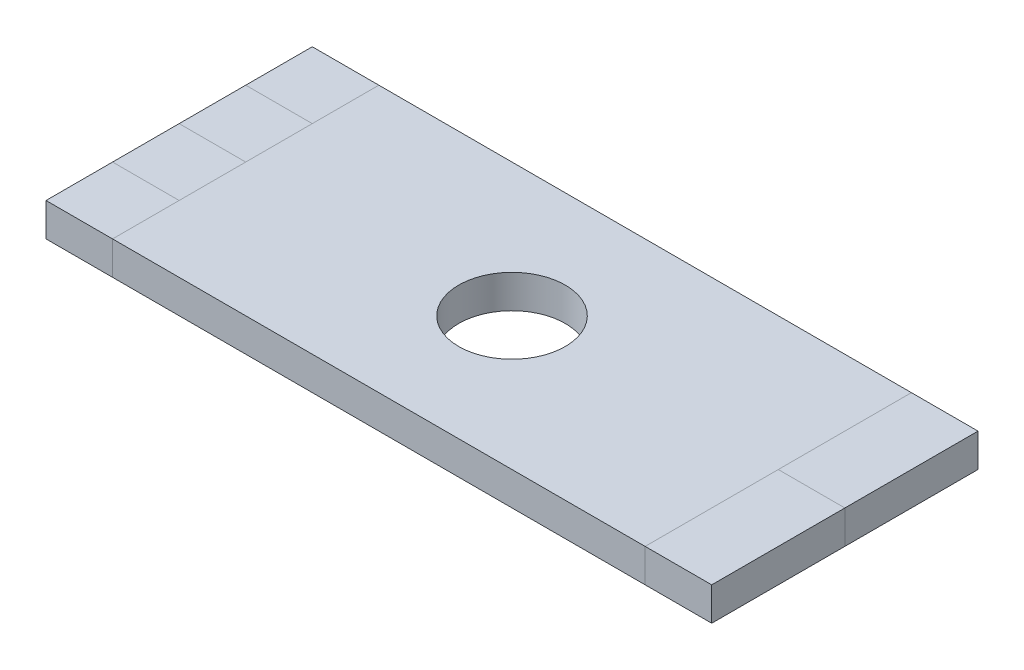
ISO-10303-21;
HEADER;
FILE_DESCRIPTION(('STEP AP214'),'2;1');
FILE_NAME('part.step','',(''),(''),'','','');
FILE_SCHEMA(('AUTOMOTIVE_DESIGN { 1 0 10303 214 1 1 1 1 }'));
ENDSEC;
DATA;
#1=APPLICATION_CONTEXT('core data for automotive mechanical design processes');
#2=APPLICATION_PROTOCOL_DEFINITION('international standard','automotive_design',2000,#1);
#3=PRODUCT_CONTEXT('',#1,'mechanical');
#4=PRODUCT('Part','Part','',(#3));
#5=PRODUCT_RELATED_PRODUCT_CATEGORY('part','',(#4));
#6=PRODUCT_DEFINITION_FORMATION('','',#4);
#7=PRODUCT_DEFINITION_CONTEXT('part definition',#1,'design');
#8=PRODUCT_DEFINITION('design','',#6,#7);
#9=PRODUCT_DEFINITION_SHAPE('','',#8);
#10=(LENGTH_UNIT() NAMED_UNIT(*) SI_UNIT(.MILLI.,.METRE.));
#11=(NAMED_UNIT(*) PLANE_ANGLE_UNIT() SI_UNIT($,.RADIAN.));
#12=(NAMED_UNIT(*) SI_UNIT($,.STERADIAN.) SOLID_ANGLE_UNIT());
#13=UNCERTAINTY_MEASURE_WITH_UNIT(LENGTH_MEASURE(1.E-05),#10,'distance_accuracy_value','');
#14=(GEOMETRIC_REPRESENTATION_CONTEXT(3) GLOBAL_UNCERTAINTY_ASSIGNED_CONTEXT((#13)) GLOBAL_UNIT_ASSIGNED_CONTEXT((#10,
#11,#12)) REPRESENTATION_CONTEXT('',''));
#15=CARTESIAN_POINT('',(0.,0.,0.));
#16=DIRECTION('',(0.,0.,1.));
#17=DIRECTION('',(1.,0.,0.));
#18=AXIS2_PLACEMENT_3D('',#15,#16,#17);
#19=CARTESIAN_POINT('',(31.75,0.,0.));
#20=DIRECTION('',(0.,0.,1.));
#21=DIRECTION('',(1.,0.,0.));
#22=AXIS2_PLACEMENT_3D('',#19,#20,#21);
#23=PLANE('',#22);
#24=DIRECTION('',(0.,1.,0.));
#25=VECTOR('',#24,1.);
#26=CARTESIAN_POINT('',(25.4,0.,0.));
#27=LINE('',#26,#25);
#28=CARTESIAN_POINT('',(25.4,0.,0.));
#29=VERTEX_POINT('',#28);
#30=CARTESIAN_POINT('',(25.4,3.175,0.));
#31=VERTEX_POINT('',#30);
#32=EDGE_CURVE('E121',#29,#31,#27,.T.);
#33=ORIENTED_EDGE('',*,*,#32,.F.);
#34=DIRECTION('',(-1.,0.,0.));
#35=VECTOR('',#34,1.);
#36=CARTESIAN_POINT('',(31.75,0.,0.));
#37=LINE('',#36,#35);
#38=CARTESIAN_POINT('',(31.75,0.,0.));
#39=VERTEX_POINT('',#38);
#40=EDGE_CURVE('E13',#39,#29,#37,.T.);
#41=ORIENTED_EDGE('',*,*,#40,.F.);
#42=DIRECTION('',(0.,1.,0.));
#43=VECTOR('',#42,1.);
#44=CARTESIAN_POINT('',(31.75,0.,0.));
#45=LINE('',#44,#43);
#46=CARTESIAN_POINT('',(31.75,3.175,0.));
#47=VERTEX_POINT('',#46);
#48=EDGE_CURVE('E109',#39,#47,#45,.T.);
#49=ORIENTED_EDGE('',*,*,#48,.T.);
#50=DIRECTION('',(-1.,0.,0.));
#51=VECTOR('',#50,1.);
#52=CARTESIAN_POINT('',(31.75,3.175,0.));
#53=LINE('',#52,#51);
#54=EDGE_CURVE('E98',#47,#31,#53,.T.);
#55=ORIENTED_EDGE('',*,*,#54,.T.);
#56=EDGE_LOOP('',(#33,#41,#49,#55));
#57=FACE_BOUND('',#56,.T.);
#58=ADVANCED_FACE('F59',(#57),#23,.T.);
#59=CARTESIAN_POINT('',(31.75,0.,0.));
#60=DIRECTION('',(0.,1.,0.));
#61=DIRECTION('',(0.,0.,1.));
#62=AXIS2_PLACEMENT_3D('',#59,#60,#61);
#63=PLANE('',#62);
#64=DIRECTION('',(0.,0.,-1.));
#65=VECTOR('',#64,1.);
#66=CARTESIAN_POINT('',(25.4,0.,0.));
#67=LINE('',#66,#65);
#68=CARTESIAN_POINT('',(25.4,0.,-12.7));
#69=VERTEX_POINT('',#68);
#70=EDGE_CURVE('E114',#29,#69,#67,.T.);
#71=ORIENTED_EDGE('',*,*,#70,.T.);
#72=DIRECTION('',(-1.,0.,0.));
#73=VECTOR('',#72,1.);
#74=CARTESIAN_POINT('',(31.75,0.,-12.7));
#75=LINE('',#74,#73);
#76=CARTESIAN_POINT('',(31.75,0.,-12.7));
#77=VERTEX_POINT('',#76);
#78=EDGE_CURVE('E67',#77,#69,#75,.T.);
#79=ORIENTED_EDGE('',*,*,#78,.F.);
#80=DIRECTION('',(0.,0.,-1.));
#81=VECTOR('',#80,1.);
#82=CARTESIAN_POINT('',(31.75,0.,0.));
#83=LINE('',#82,#81);
#84=EDGE_CURVE('E104',#39,#77,#83,.T.);
#85=ORIENTED_EDGE('',*,*,#84,.F.);
#86=ORIENTED_EDGE('',*,*,#40,.T.);
#87=EDGE_LOOP('',(#71,#79,#85,#86));
#88=FACE_BOUND('',#87,.T.);
#89=ADVANCED_FACE('F112',(#88),#63,.F.);
#90=CARTESIAN_POINT('',(31.75,0.,-12.7));
#91=DIRECTION('',(0.,0.,1.));
#92=DIRECTION('',(1.,0.,0.));
#93=AXIS2_PLACEMENT_3D('',#90,#91,#92);
#94=PLANE('',#93);
#95=DIRECTION('',(0.,1.,0.));
#96=VECTOR('',#95,1.);
#97=CARTESIAN_POINT('',(25.4,0.,-12.7));
#98=LINE('',#97,#96);
#99=CARTESIAN_POINT('',(25.4,3.175,-12.7));
#100=VERTEX_POINT('',#99);
#101=EDGE_CURVE('E91',#69,#100,#98,.T.);
#102=ORIENTED_EDGE('',*,*,#101,.T.);
#103=DIRECTION('',(-1.,0.,0.));
#104=VECTOR('',#103,1.);
#105=CARTESIAN_POINT('',(31.75,3.175,-12.7));
#106=LINE('',#105,#104);
#107=CARTESIAN_POINT('',(31.75,3.175,-12.7));
#108=VERTEX_POINT('',#107);
#109=EDGE_CURVE('E115',#108,#100,#106,.T.);
#110=ORIENTED_EDGE('',*,*,#109,.F.);
#111=DIRECTION('',(0.,1.,0.));
#112=VECTOR('',#111,1.);
#113=CARTESIAN_POINT('',(31.75,0.,-12.7));
#114=LINE('',#113,#112);
#115=EDGE_CURVE('E108',#77,#108,#114,.T.);
#116=ORIENTED_EDGE('',*,*,#115,.F.);
#117=ORIENTED_EDGE('',*,*,#78,.T.);
#118=EDGE_LOOP('',(#102,#110,#116,#117));
#119=FACE_BOUND('',#118,.T.);
#120=ADVANCED_FACE('F116',(#119),#94,.F.);
#121=CARTESIAN_POINT('',(31.75,3.175,0.));
#122=DIRECTION('',(0.,-1.,0.));
#123=DIRECTION('',(0.,0.,-1.));
#124=AXIS2_PLACEMENT_3D('',#121,#122,#123);
#125=PLANE('',#124);
#126=DIRECTION('',(0.,0.,1.));
#127=VECTOR('',#126,1.);
#128=CARTESIAN_POINT('',(25.4,3.175,0.));
#129=LINE('',#128,#127);
#130=EDGE_CURVE('E126',#100,#31,#129,.T.);
#131=ORIENTED_EDGE('',*,*,#130,.T.);
#132=ORIENTED_EDGE('',*,*,#54,.F.);
#133=DIRECTION('',(0.,0.,1.));
#134=VECTOR('',#133,1.);
#135=CARTESIAN_POINT('',(31.75,3.175,0.));
#136=LINE('',#135,#134);
#137=EDGE_CURVE('E75',#108,#47,#136,.T.);
#138=ORIENTED_EDGE('',*,*,#137,.F.);
#139=ORIENTED_EDGE('',*,*,#109,.T.);
#140=EDGE_LOOP('',(#131,#132,#138,#139));
#141=FACE_BOUND('',#140,.T.);
#142=ADVANCED_FACE('F132',(#141),#125,.F.);
#143=CARTESIAN_POINT('',(31.75,0.,0.));
#144=DIRECTION('',(1.,0.,0.));
#145=DIRECTION('',(0.,0.,-1.));
#146=AXIS2_PLACEMENT_3D('',#143,#144,#145);
#147=PLANE('',#146);
#148=ORIENTED_EDGE('',*,*,#48,.F.);
#149=ORIENTED_EDGE('',*,*,#84,.T.);
#150=ORIENTED_EDGE('',*,*,#115,.T.);
#151=ORIENTED_EDGE('',*,*,#137,.T.);
#152=EDGE_LOOP('',(#148,#149,#150,#151));
#153=FACE_BOUND('',#152,.T.);
#154=ADVANCED_FACE('F106',(#153),#147,.T.);
#155=CARTESIAN_POINT('',(25.4,0.,0.));
#156=DIRECTION('',(1.,0.,0.));
#157=DIRECTION('',(0.,0.,-1.));
#158=AXIS2_PLACEMENT_3D('',#155,#156,#157);
#159=PLANE('',#158);
#160=ORIENTED_EDGE('',*,*,#32,.T.);
#161=ORIENTED_EDGE('',*,*,#130,.F.);
#162=ORIENTED_EDGE('',*,*,#101,.F.);
#163=ORIENTED_EDGE('',*,*,#70,.F.);
#164=EDGE_LOOP('',(#160,#161,#162,#163));
#165=FACE_BOUND('',#164,.T.);
#166=ADVANCED_FACE('F134',(#165),#159,.F.);
#167=CLOSED_SHELL('',(#58,#89,#120,#142,#154,#166));
#168=MANIFOLD_SOLID_BREP('B2',#167);
#169=CARTESIAN_POINT('',(31.75,0.,0.));
#170=DIRECTION('',(0.,1.,0.));
#171=DIRECTION('',(0.,0.,1.));
#172=AXIS2_PLACEMENT_3D('',#169,#170,#171);
#173=PLANE('',#172);
#174=DIRECTION('',(0.,0.,-1.));
#175=VECTOR('',#174,1.);
#176=CARTESIAN_POINT('',(25.4,0.,0.));
#177=LINE('',#176,#175);
#178=CARTESIAN_POINT('',(25.4,0.,12.7));
#179=VERTEX_POINT('',#178);
#180=CARTESIAN_POINT('',(25.4,0.,0.));
#181=VERTEX_POINT('',#180);
#182=EDGE_CURVE('E271',#179,#181,#177,.T.);
#183=ORIENTED_EDGE('',*,*,#182,.T.);
#184=DIRECTION('',(-1.,0.,0.));
#185=VECTOR('',#184,1.);
#186=CARTESIAN_POINT('',(31.75,0.,0.));
#187=LINE('',#186,#185);
#188=CARTESIAN_POINT('',(31.75,0.,0.));
#189=VERTEX_POINT('',#188);
#190=EDGE_CURVE('E57',#189,#181,#187,.T.);
#191=ORIENTED_EDGE('',*,*,#190,.F.);
#192=DIRECTION('',(0.,0.,-1.));
#193=VECTOR('',#192,1.);
#194=CARTESIAN_POINT('',(31.75,0.,0.));
#195=LINE('',#194,#193);
#196=CARTESIAN_POINT('',(31.75,0.,12.7));
#197=VERTEX_POINT('',#196);
#198=EDGE_CURVE('E258',#197,#189,#195,.T.);
#199=ORIENTED_EDGE('',*,*,#198,.F.);
#200=DIRECTION('',(-1.,0.,0.));
#201=VECTOR('',#200,1.);
#202=CARTESIAN_POINT('',(31.75,0.,12.7));
#203=LINE('',#202,#201);
#204=EDGE_CURVE('E267',#197,#179,#203,.T.);
#205=ORIENTED_EDGE('',*,*,#204,.T.);
#206=EDGE_LOOP('',(#183,#191,#199,#205));
#207=FACE_BOUND('',#206,.T.);
#208=ADVANCED_FACE('F208',(#207),#173,.F.);
#209=CARTESIAN_POINT('',(31.75,0.,0.));
#210=DIRECTION('',(0.,0.,1.));
#211=DIRECTION('',(1.,0.,0.));
#212=AXIS2_PLACEMENT_3D('',#209,#210,#211);
#213=PLANE('',#212);
#214=DIRECTION('',(0.,1.,0.));
#215=VECTOR('',#214,1.);
#216=CARTESIAN_POINT('',(25.4,0.,0.));
#217=LINE('',#216,#215);
#218=CARTESIAN_POINT('',(25.4,3.175,0.));
#219=VERTEX_POINT('',#218);
#220=EDGE_CURVE('E262',#181,#219,#217,.T.);
#221=ORIENTED_EDGE('',*,*,#220,.T.);
#222=DIRECTION('',(-1.,0.,0.));
#223=VECTOR('',#222,1.);
#224=CARTESIAN_POINT('',(31.75,3.175,0.));
#225=LINE('',#224,#223);
#226=CARTESIAN_POINT('',(31.75,3.175,0.));
#227=VERTEX_POINT('',#226);
#228=EDGE_CURVE('E215',#227,#219,#225,.T.);
#229=ORIENTED_EDGE('',*,*,#228,.F.);
#230=DIRECTION('',(0.,1.,0.));
#231=VECTOR('',#230,1.);
#232=CARTESIAN_POINT('',(31.75,0.,0.));
#233=LINE('',#232,#231);
#234=EDGE_CURVE('E253',#189,#227,#233,.T.);
#235=ORIENTED_EDGE('',*,*,#234,.F.);
#236=ORIENTED_EDGE('',*,*,#190,.T.);
#237=EDGE_LOOP('',(#221,#229,#235,#236));
#238=FACE_BOUND('',#237,.T.);
#239=ADVANCED_FACE('F261',(#238),#213,.F.);
#240=CARTESIAN_POINT('',(31.75,3.175,0.));
#241=DIRECTION('',(0.,-1.,0.));
#242=DIRECTION('',(0.,0.,-1.));
#243=AXIS2_PLACEMENT_3D('',#240,#241,#242);
#244=PLANE('',#243);
#245=DIRECTION('',(0.,0.,1.));
#246=VECTOR('',#245,1.);
#247=CARTESIAN_POINT('',(25.4,3.175,0.));
#248=LINE('',#247,#246);
#249=CARTESIAN_POINT('',(25.4,3.175,12.7));
#250=VERTEX_POINT('',#249);
#251=EDGE_CURVE('E240',#219,#250,#248,.T.);
#252=ORIENTED_EDGE('',*,*,#251,.T.);
#253=DIRECTION('',(-1.,0.,0.));
#254=VECTOR('',#253,1.);
#255=CARTESIAN_POINT('',(31.75,3.175,12.7));
#256=LINE('',#255,#254);
#257=CARTESIAN_POINT('',(31.75,3.175,12.7));
#258=VERTEX_POINT('',#257);
#259=EDGE_CURVE('E264',#258,#250,#256,.T.);
#260=ORIENTED_EDGE('',*,*,#259,.F.);
#261=DIRECTION('',(0.,0.,1.));
#262=VECTOR('',#261,1.);
#263=CARTESIAN_POINT('',(31.75,3.175,0.));
#264=LINE('',#263,#262);
#265=EDGE_CURVE('E256',#227,#258,#264,.T.);
#266=ORIENTED_EDGE('',*,*,#265,.F.);
#267=ORIENTED_EDGE('',*,*,#228,.T.);
#268=EDGE_LOOP('',(#252,#260,#266,#267));
#269=FACE_BOUND('',#268,.T.);
#270=ADVANCED_FACE('F265',(#269),#244,.F.);
#271=CARTESIAN_POINT('',(31.75,0.,12.7));
#272=DIRECTION('',(0.,0.,-1.));
#273=DIRECTION('',(-1.,0.,0.));
#274=AXIS2_PLACEMENT_3D('',#271,#272,#273);
#275=PLANE('',#274);
#276=DIRECTION('',(0.,-1.,0.));
#277=VECTOR('',#276,1.);
#278=CARTESIAN_POINT('',(25.4,0.,12.7));
#279=LINE('',#278,#277);
#280=EDGE_CURVE('E246',#250,#179,#279,.T.);
#281=ORIENTED_EDGE('',*,*,#280,.T.);
#282=ORIENTED_EDGE('',*,*,#204,.F.);
#283=DIRECTION('',(0.,-1.,0.));
#284=VECTOR('',#283,1.);
#285=CARTESIAN_POINT('',(31.75,0.,12.7));
#286=LINE('',#285,#284);
#287=EDGE_CURVE('E223',#258,#197,#286,.T.);
#288=ORIENTED_EDGE('',*,*,#287,.F.);
#289=ORIENTED_EDGE('',*,*,#259,.T.);
#290=EDGE_LOOP('',(#281,#282,#288,#289));
#291=FACE_BOUND('',#290,.T.);
#292=ADVANCED_FACE('F279',(#291),#275,.F.);
#293=CARTESIAN_POINT('',(31.75,0.,0.));
#294=DIRECTION('',(1.,0.,0.));
#295=DIRECTION('',(0.,0.,-1.));
#296=AXIS2_PLACEMENT_3D('',#293,#294,#295);
#297=PLANE('',#296);
#298=ORIENTED_EDGE('',*,*,#198,.T.);
#299=ORIENTED_EDGE('',*,*,#234,.T.);
#300=ORIENTED_EDGE('',*,*,#265,.T.);
#301=ORIENTED_EDGE('',*,*,#287,.T.);
#302=EDGE_LOOP('',(#298,#299,#300,#301));
#303=FACE_BOUND('',#302,.T.);
#304=ADVANCED_FACE('F254',(#303),#297,.T.);
#305=CARTESIAN_POINT('',(25.4,0.,0.));
#306=DIRECTION('',(1.,0.,0.));
#307=DIRECTION('',(0.,0.,-1.));
#308=AXIS2_PLACEMENT_3D('',#305,#306,#307);
#309=PLANE('',#308);
#310=ORIENTED_EDGE('',*,*,#182,.F.);
#311=ORIENTED_EDGE('',*,*,#280,.F.);
#312=ORIENTED_EDGE('',*,*,#251,.F.);
#313=ORIENTED_EDGE('',*,*,#220,.F.);
#314=EDGE_LOOP('',(#310,#311,#312,#313));
#315=FACE_BOUND('',#314,.T.);
#316=ADVANCED_FACE('F282',(#315),#309,.F.);
#317=CLOSED_SHELL('',(#208,#239,#270,#292,#304,#316));
#318=MANIFOLD_SOLID_BREP('B7',#317);
#319=CARTESIAN_POINT('',(-31.75,3.175,0.));
#320=DIRECTION('',(0.,-1.,0.));
#321=DIRECTION('',(0.,0.,-1.));
#322=AXIS2_PLACEMENT_3D('',#319,#320,#321);
#323=PLANE('',#322);
#324=DIRECTION('',(0.,0.,-1.));
#325=VECTOR('',#324,1.);
#326=CARTESIAN_POINT('',(-25.4,3.175,0.));
#327=LINE('',#326,#325);
#328=CARTESIAN_POINT('',(-25.4,3.175,12.7));
#329=VERTEX_POINT('',#328);
#330=CARTESIAN_POINT('',(-25.4,3.175,6.35));
#331=VERTEX_POINT('',#330);
#332=EDGE_CURVE('E419',#329,#331,#327,.T.);
#333=ORIENTED_EDGE('',*,*,#332,.T.);
#334=DIRECTION('',(1.,0.,0.));
#335=VECTOR('',#334,1.);
#336=CARTESIAN_POINT('',(-31.75,3.175,6.35));
#337=LINE('',#336,#335);
#338=CARTESIAN_POINT('',(-31.75,3.175,6.35));
#339=VERTEX_POINT('',#338);
#340=EDGE_CURVE('E206',#339,#331,#337,.T.);
#341=ORIENTED_EDGE('',*,*,#340,.F.);
#342=DIRECTION('',(0.,0.,-1.));
#343=VECTOR('',#342,1.);
#344=CARTESIAN_POINT('',(-31.75,3.175,0.));
#345=LINE('',#344,#343);
#346=CARTESIAN_POINT('',(-31.75,3.175,12.7));
#347=VERTEX_POINT('',#346);
#348=EDGE_CURVE('E407',#347,#339,#345,.T.);
#349=ORIENTED_EDGE('',*,*,#348,.F.);
#350=DIRECTION('',(1.,0.,0.));
#351=VECTOR('',#350,1.);
#352=CARTESIAN_POINT('',(-31.75,3.175,12.7));
#353=LINE('',#352,#351);
#354=EDGE_CURVE('E415',#347,#329,#353,.T.);
#355=ORIENTED_EDGE('',*,*,#354,.T.);
#356=EDGE_LOOP('',(#333,#341,#349,#355));
#357=FACE_BOUND('',#356,.T.);
#358=ADVANCED_FACE('F356',(#357),#323,.F.);
#359=CARTESIAN_POINT('',(-31.75,0.,6.35));
#360=DIRECTION('',(0.,0.,1.));
#361=DIRECTION('',(0.,-1.,0.));
#362=AXIS2_PLACEMENT_3D('',#359,#360,#361);
#363=PLANE('',#362);
#364=DIRECTION('',(0.,-1.,0.));
#365=VECTOR('',#364,1.);
#366=CARTESIAN_POINT('',(-25.4,0.,6.35));
#367=LINE('',#366,#365);
#368=CARTESIAN_POINT('',(-25.4,0.,6.35));
#369=VERTEX_POINT('',#368);
#370=EDGE_CURVE('E411',#331,#369,#367,.T.);
#371=ORIENTED_EDGE('',*,*,#370,.T.);
#372=DIRECTION('',(1.,0.,0.));
#373=VECTOR('',#372,1.);
#374=CARTESIAN_POINT('',(-31.75,0.,6.35));
#375=LINE('',#374,#373);
#376=CARTESIAN_POINT('',(-31.75,0.,6.35));
#377=VERTEX_POINT('',#376);
#378=EDGE_CURVE('E364',#377,#369,#375,.T.);
#379=ORIENTED_EDGE('',*,*,#378,.F.);
#380=DIRECTION('',(0.,-1.,0.));
#381=VECTOR('',#380,1.);
#382=CARTESIAN_POINT('',(-31.75,0.,6.35));
#383=LINE('',#382,#381);
#384=EDGE_CURVE('E402',#339,#377,#383,.T.);
#385=ORIENTED_EDGE('',*,*,#384,.F.);
#386=ORIENTED_EDGE('',*,*,#340,.T.);
#387=EDGE_LOOP('',(#371,#379,#385,#386));
#388=FACE_BOUND('',#387,.T.);
#389=ADVANCED_FACE('F410',(#388),#363,.F.);
#390=CARTESIAN_POINT('',(-31.75,0.,0.));
#391=DIRECTION('',(0.,1.,0.));
#392=DIRECTION('',(0.,0.,1.));
#393=AXIS2_PLACEMENT_3D('',#390,#391,#392);
#394=PLANE('',#393);
#395=DIRECTION('',(0.,0.,1.));
#396=VECTOR('',#395,1.);
#397=CARTESIAN_POINT('',(-25.4,0.,0.));
#398=LINE('',#397,#396);
#399=CARTESIAN_POINT('',(-25.4,0.,12.7));
#400=VERTEX_POINT('',#399);
#401=EDGE_CURVE('E389',#369,#400,#398,.T.);
#402=ORIENTED_EDGE('',*,*,#401,.T.);
#403=DIRECTION('',(1.,0.,0.));
#404=VECTOR('',#403,1.);
#405=CARTESIAN_POINT('',(-31.75,0.,12.7));
#406=LINE('',#405,#404);
#407=CARTESIAN_POINT('',(-31.75,0.,12.7));
#408=VERTEX_POINT('',#407);
#409=EDGE_CURVE('E412',#408,#400,#406,.T.);
#410=ORIENTED_EDGE('',*,*,#409,.F.);
#411=DIRECTION('',(0.,0.,1.));
#412=VECTOR('',#411,1.);
#413=CARTESIAN_POINT('',(-31.75,0.,0.));
#414=LINE('',#413,#412);
#415=EDGE_CURVE('E405',#377,#408,#414,.T.);
#416=ORIENTED_EDGE('',*,*,#415,.F.);
#417=ORIENTED_EDGE('',*,*,#378,.T.);
#418=EDGE_LOOP('',(#402,#410,#416,#417));
#419=FACE_BOUND('',#418,.T.);
#420=ADVANCED_FACE('F413',(#419),#394,.F.);
#421=CARTESIAN_POINT('',(-31.75,0.,12.7));
#422=DIRECTION('',(0.,0.,-1.));
#423=DIRECTION('',(-1.,0.,0.));
#424=AXIS2_PLACEMENT_3D('',#421,#422,#423);
#425=PLANE('',#424);
#426=DIRECTION('',(0.,1.,0.));
#427=VECTOR('',#426,1.);
#428=CARTESIAN_POINT('',(-25.4,0.,12.7));
#429=LINE('',#428,#427);
#430=EDGE_CURVE('E395',#400,#329,#429,.T.);
#431=ORIENTED_EDGE('',*,*,#430,.T.);
#432=ORIENTED_EDGE('',*,*,#354,.F.);
#433=DIRECTION('',(0.,1.,0.));
#434=VECTOR('',#433,1.);
#435=CARTESIAN_POINT('',(-31.75,0.,12.7));
#436=LINE('',#435,#434);
#437=EDGE_CURVE('E372',#408,#347,#436,.T.);
#438=ORIENTED_EDGE('',*,*,#437,.F.);
#439=ORIENTED_EDGE('',*,*,#409,.T.);
#440=EDGE_LOOP('',(#431,#432,#438,#439));
#441=FACE_BOUND('',#440,.T.);
#442=ADVANCED_FACE('F426',(#441),#425,.F.);
#443=CARTESIAN_POINT('',(-31.75,0.,0.));
#444=DIRECTION('',(-1.,0.,0.));
#445=DIRECTION('',(0.,0.,1.));
#446=AXIS2_PLACEMENT_3D('',#443,#444,#445);
#447=PLANE('',#446);
#448=ORIENTED_EDGE('',*,*,#348,.T.);
#449=ORIENTED_EDGE('',*,*,#384,.T.);
#450=ORIENTED_EDGE('',*,*,#415,.T.);
#451=ORIENTED_EDGE('',*,*,#437,.T.);
#452=EDGE_LOOP('',(#448,#449,#450,#451));
#453=FACE_BOUND('',#452,.T.);
#454=ADVANCED_FACE('F403',(#453),#447,.T.);
#455=CARTESIAN_POINT('',(-25.4,0.,0.));
#456=DIRECTION('',(-1.,0.,0.));
#457=DIRECTION('',(0.,0.,1.));
#458=AXIS2_PLACEMENT_3D('',#455,#456,#457);
#459=PLANE('',#458);
#460=ORIENTED_EDGE('',*,*,#332,.F.);
#461=ORIENTED_EDGE('',*,*,#430,.F.);
#462=ORIENTED_EDGE('',*,*,#401,.F.);
#463=ORIENTED_EDGE('',*,*,#370,.F.);
#464=EDGE_LOOP('',(#460,#461,#462,#463));
#465=FACE_BOUND('',#464,.T.);
#466=ADVANCED_FACE('F429',(#465),#459,.F.);
#467=CLOSED_SHELL('',(#358,#389,#420,#442,#454,#466));
#468=MANIFOLD_SOLID_BREP('B51',#467);
#469=CARTESIAN_POINT('',(-31.75,0.,6.35));
#470=DIRECTION('',(0.,0.,1.));
#471=DIRECTION('',(0.,-1.,0.));
#472=AXIS2_PLACEMENT_3D('',#469,#470,#471);
#473=PLANE('',#472);
#474=DIRECTION('',(0.,-1.,0.));
#475=VECTOR('',#474,1.);
#476=CARTESIAN_POINT('',(-25.4,0.,6.35));
#477=LINE('',#476,#475);
#478=CARTESIAN_POINT('',(-25.4,3.175,6.35));
#479=VERTEX_POINT('',#478);
#480=CARTESIAN_POINT('',(-25.4,0.,6.35));
#481=VERTEX_POINT('',#480);
#482=EDGE_CURVE('E565',#479,#481,#477,.T.);
#483=ORIENTED_EDGE('',*,*,#482,.F.);
#484=DIRECTION('',(1.,0.,0.));
#485=VECTOR('',#484,1.);
#486=CARTESIAN_POINT('',(-31.75,3.175,6.35));
#487=LINE('',#486,#485);
#488=CARTESIAN_POINT('',(-31.75,3.175,6.35));
#489=VERTEX_POINT('',#488);
#490=EDGE_CURVE('E354',#489,#479,#487,.T.);
#491=ORIENTED_EDGE('',*,*,#490,.F.);
#492=DIRECTION('',(0.,-1.,0.));
#493=VECTOR('',#492,1.);
#494=CARTESIAN_POINT('',(-31.75,0.,6.35));
#495=LINE('',#494,#493);
#496=CARTESIAN_POINT('',(-31.75,0.,6.35));
#497=VERTEX_POINT('',#496);
#498=EDGE_CURVE('E550',#489,#497,#495,.T.);
#499=ORIENTED_EDGE('',*,*,#498,.T.);
#500=DIRECTION('',(1.,0.,0.));
#501=VECTOR('',#500,1.);
#502=CARTESIAN_POINT('',(-31.75,0.,6.35));
#503=LINE('',#502,#501);
#504=EDGE_CURVE('E540',#497,#481,#503,.T.);
#505=ORIENTED_EDGE('',*,*,#504,.T.);
#506=EDGE_LOOP('',(#483,#491,#499,#505));
#507=FACE_BOUND('',#506,.T.);
#508=ADVANCED_FACE('F502',(#507),#473,.T.);
#509=CARTESIAN_POINT('',(-31.75,3.175,0.));
#510=DIRECTION('',(0.,-1.,0.));
#511=DIRECTION('',(0.,0.,-1.));
#512=AXIS2_PLACEMENT_3D('',#509,#510,#511);
#513=PLANE('',#512);
#514=DIRECTION('',(0.,0.,-1.));
#515=VECTOR('',#514,1.);
#516=CARTESIAN_POINT('',(-25.4,3.175,0.));
#517=LINE('',#516,#515);
#518=CARTESIAN_POINT('',(-25.4,3.175,0.));
#519=VERTEX_POINT('',#518);
#520=EDGE_CURVE('E556',#479,#519,#517,.T.);
#521=ORIENTED_EDGE('',*,*,#520,.T.);
#522=DIRECTION('',(1.,0.,0.));
#523=VECTOR('',#522,1.);
#524=CARTESIAN_POINT('',(-31.75,3.175,0.));
#525=LINE('',#524,#523);
#526=CARTESIAN_POINT('',(-31.75,3.175,0.));
#527=VERTEX_POINT('',#526);
#528=EDGE_CURVE('E510',#527,#519,#525,.T.);
#529=ORIENTED_EDGE('',*,*,#528,.F.);
#530=DIRECTION('',(0.,0.,-1.));
#531=VECTOR('',#530,1.);
#532=CARTESIAN_POINT('',(-31.75,3.175,0.));
#533=LINE('',#532,#531);
#534=EDGE_CURVE('E545',#489,#527,#533,.T.);
#535=ORIENTED_EDGE('',*,*,#534,.F.);
#536=ORIENTED_EDGE('',*,*,#490,.T.);
#537=EDGE_LOOP('',(#521,#529,#535,#536));
#538=FACE_BOUND('',#537,.T.);
#539=ADVANCED_FACE('F554',(#538),#513,.F.);
#540=CARTESIAN_POINT('',(-31.75,0.,0.));
#541=DIRECTION('',(0.,0.,-1.));
#542=DIRECTION('',(-1.,0.,0.));
#543=AXIS2_PLACEMENT_3D('',#540,#541,#542);
#544=PLANE('',#543);
#545=DIRECTION('',(0.,1.,0.));
#546=VECTOR('',#545,1.);
#547=CARTESIAN_POINT('',(-25.4,0.,0.));
#548=LINE('',#547,#546);
#549=CARTESIAN_POINT('',(-25.4,0.,0.));
#550=VERTEX_POINT('',#549);
#551=EDGE_CURVE('E569',#550,#519,#548,.T.);
#552=ORIENTED_EDGE('',*,*,#551,.F.);
#553=DIRECTION('',(1.,0.,0.));
#554=VECTOR('',#553,1.);
#555=CARTESIAN_POINT('',(-31.75,0.,0.));
#556=LINE('',#555,#554);
#557=CARTESIAN_POINT('',(-31.75,0.,0.));
#558=VERTEX_POINT('',#557);
#559=EDGE_CURVE('E533',#558,#550,#556,.T.);
#560=ORIENTED_EDGE('',*,*,#559,.F.);
#561=DIRECTION('',(0.,1.,0.));
#562=VECTOR('',#561,1.);
#563=CARTESIAN_POINT('',(-31.75,0.,0.));
#564=LINE('',#563,#562);
#565=EDGE_CURVE('E549',#558,#527,#564,.T.);
#566=ORIENTED_EDGE('',*,*,#565,.T.);
#567=ORIENTED_EDGE('',*,*,#528,.T.);
#568=EDGE_LOOP('',(#552,#560,#566,#567));
#569=FACE_BOUND('',#568,.T.);
#570=ADVANCED_FACE('F560',(#569),#544,.T.);
#571=CARTESIAN_POINT('',(-31.75,0.,0.));
#572=DIRECTION('',(0.,1.,0.));
#573=DIRECTION('',(0.,0.,1.));
#574=AXIS2_PLACEMENT_3D('',#571,#572,#573);
#575=PLANE('',#574);
#576=DIRECTION('',(0.,0.,1.));
#577=VECTOR('',#576,1.);
#578=CARTESIAN_POINT('',(-25.4,0.,0.));
#579=LINE('',#578,#577);
#580=EDGE_CURVE('E571',#550,#481,#579,.T.);
#581=ORIENTED_EDGE('',*,*,#580,.T.);
#582=ORIENTED_EDGE('',*,*,#504,.F.);
#583=DIRECTION('',(0.,0.,1.));
#584=VECTOR('',#583,1.);
#585=CARTESIAN_POINT('',(-31.75,0.,0.));
#586=LINE('',#585,#584);
#587=EDGE_CURVE('E518',#558,#497,#586,.T.);
#588=ORIENTED_EDGE('',*,*,#587,.F.);
#589=ORIENTED_EDGE('',*,*,#559,.T.);
#590=EDGE_LOOP('',(#581,#582,#588,#589));
#591=FACE_BOUND('',#590,.T.);
#592=ADVANCED_FACE('F581',(#591),#575,.F.);
#593=CARTESIAN_POINT('',(-31.75,0.,0.));
#594=DIRECTION('',(-1.,0.,0.));
#595=DIRECTION('',(0.,0.,1.));
#596=AXIS2_PLACEMENT_3D('',#593,#594,#595);
#597=PLANE('',#596);
#598=ORIENTED_EDGE('',*,*,#498,.F.);
#599=ORIENTED_EDGE('',*,*,#534,.T.);
#600=ORIENTED_EDGE('',*,*,#565,.F.);
#601=ORIENTED_EDGE('',*,*,#587,.T.);
#602=EDGE_LOOP('',(#598,#599,#600,#601));
#603=FACE_BOUND('',#602,.T.);
#604=ADVANCED_FACE('F547',(#603),#597,.T.);
#605=CARTESIAN_POINT('',(-25.4,0.,0.));
#606=DIRECTION('',(-1.,0.,0.));
#607=DIRECTION('',(0.,0.,1.));
#608=AXIS2_PLACEMENT_3D('',#605,#606,#607);
#609=PLANE('',#608);
#610=ORIENTED_EDGE('',*,*,#482,.T.);
#611=ORIENTED_EDGE('',*,*,#580,.F.);
#612=ORIENTED_EDGE('',*,*,#551,.T.);
#613=ORIENTED_EDGE('',*,*,#520,.F.);
#614=EDGE_LOOP('',(#610,#611,#612,#613));
#615=FACE_BOUND('',#614,.T.);
#616=ADVANCED_FACE('F586',(#615),#609,.F.);
#617=CLOSED_SHELL('',(#508,#539,#570,#592,#604,#616));
#618=MANIFOLD_SOLID_BREP('B200',#617);
#619=CARTESIAN_POINT('',(-31.75,0.,0.));
#620=DIRECTION('',(0.,1.,0.));
#621=DIRECTION('',(0.,0.,1.));
#622=AXIS2_PLACEMENT_3D('',#619,#620,#621);
#623=PLANE('',#622);
#624=DIRECTION('',(0.,0.,1.));
#625=VECTOR('',#624,1.);
#626=CARTESIAN_POINT('',(-25.4,0.,0.));
#627=LINE('',#626,#625);
#628=CARTESIAN_POINT('',(-25.4,0.,-6.35));
#629=VERTEX_POINT('',#628);
#630=CARTESIAN_POINT('',(-25.4,0.,0.));
#631=VERTEX_POINT('',#630);
#632=EDGE_CURVE('E712',#629,#631,#627,.T.);
#633=ORIENTED_EDGE('',*,*,#632,.T.);
#634=DIRECTION('',(1.,0.,0.));
#635=VECTOR('',#634,1.);
#636=CARTESIAN_POINT('',(-31.75,0.,0.));
#637=LINE('',#636,#635);
#638=CARTESIAN_POINT('',(-31.75,0.,0.));
#639=VERTEX_POINT('',#638);
#640=EDGE_CURVE('E500',#639,#631,#637,.T.);
#641=ORIENTED_EDGE('',*,*,#640,.F.);
#642=DIRECTION('',(0.,0.,1.));
#643=VECTOR('',#642,1.);
#644=CARTESIAN_POINT('',(-31.75,0.,0.));
#645=LINE('',#644,#643);
#646=CARTESIAN_POINT('',(-31.75,0.,-6.35));
#647=VERTEX_POINT('',#646);
#648=EDGE_CURVE('E700',#647,#639,#645,.T.);
#649=ORIENTED_EDGE('',*,*,#648,.F.);
#650=DIRECTION('',(1.,0.,0.));
#651=VECTOR('',#650,1.);
#652=CARTESIAN_POINT('',(-31.75,0.,-6.35));
#653=LINE('',#652,#651);
#654=EDGE_CURVE('E708',#647,#629,#653,.T.);
#655=ORIENTED_EDGE('',*,*,#654,.T.);
#656=EDGE_LOOP('',(#633,#641,#649,#655));
#657=FACE_BOUND('',#656,.T.);
#658=ADVANCED_FACE('F649',(#657),#623,.F.);
#659=CARTESIAN_POINT('',(-31.75,0.,0.));
#660=DIRECTION('',(0.,0.,-1.));
#661=DIRECTION('',(-1.,0.,0.));
#662=AXIS2_PLACEMENT_3D('',#659,#660,#661);
#663=PLANE('',#662);
#664=DIRECTION('',(0.,1.,0.));
#665=VECTOR('',#664,1.);
#666=CARTESIAN_POINT('',(-25.4,0.,0.));
#667=LINE('',#666,#665);
#668=CARTESIAN_POINT('',(-25.4,3.175,0.));
#669=VERTEX_POINT('',#668);
#670=EDGE_CURVE('E704',#631,#669,#667,.T.);
#671=ORIENTED_EDGE('',*,*,#670,.T.);
#672=DIRECTION('',(1.,0.,0.));
#673=VECTOR('',#672,1.);
#674=CARTESIAN_POINT('',(-31.75,3.175,0.));
#675=LINE('',#674,#673);
#676=CARTESIAN_POINT('',(-31.75,3.175,0.));
#677=VERTEX_POINT('',#676);
#678=EDGE_CURVE('E657',#677,#669,#675,.T.);
#679=ORIENTED_EDGE('',*,*,#678,.F.);
#680=DIRECTION('',(0.,1.,0.));
#681=VECTOR('',#680,1.);
#682=CARTESIAN_POINT('',(-31.75,0.,0.));
#683=LINE('',#682,#681);
#684=EDGE_CURVE('E695',#639,#677,#683,.T.);
#685=ORIENTED_EDGE('',*,*,#684,.F.);
#686=ORIENTED_EDGE('',*,*,#640,.T.);
#687=EDGE_LOOP('',(#671,#679,#685,#686));
#688=FACE_BOUND('',#687,.T.);
#689=ADVANCED_FACE('F703',(#688),#663,.F.);
#690=CARTESIAN_POINT('',(-31.75,3.175,0.));
#691=DIRECTION('',(0.,-1.,0.));
#692=DIRECTION('',(0.,0.,-1.));
#693=AXIS2_PLACEMENT_3D('',#690,#691,#692);
#694=PLANE('',#693);
#695=DIRECTION('',(0.,0.,-1.));
#696=VECTOR('',#695,1.);
#697=CARTESIAN_POINT('',(-25.4,3.175,0.));
#698=LINE('',#697,#696);
#699=CARTESIAN_POINT('',(-25.4,3.175,-6.35));
#700=VERTEX_POINT('',#699);
#701=EDGE_CURVE('E682',#669,#700,#698,.T.);
#702=ORIENTED_EDGE('',*,*,#701,.T.);
#703=DIRECTION('',(1.,0.,0.));
#704=VECTOR('',#703,1.);
#705=CARTESIAN_POINT('',(-31.75,3.175,-6.35));
#706=LINE('',#705,#704);
#707=CARTESIAN_POINT('',(-31.75,3.175,-6.35));
#708=VERTEX_POINT('',#707);
#709=EDGE_CURVE('E705',#708,#700,#706,.T.);
#710=ORIENTED_EDGE('',*,*,#709,.F.);
#711=DIRECTION('',(0.,0.,-1.));
#712=VECTOR('',#711,1.);
#713=CARTESIAN_POINT('',(-31.75,3.175,0.));
#714=LINE('',#713,#712);
#715=EDGE_CURVE('E698',#677,#708,#714,.T.);
#716=ORIENTED_EDGE('',*,*,#715,.F.);
#717=ORIENTED_EDGE('',*,*,#678,.T.);
#718=EDGE_LOOP('',(#702,#710,#716,#717));
#719=FACE_BOUND('',#718,.T.);
#720=ADVANCED_FACE('F706',(#719),#694,.F.);
#721=CARTESIAN_POINT('',(-31.75,0.,-6.35));
#722=DIRECTION('',(0.,0.,1.));
#723=DIRECTION('',(1.,0.,0.));
#724=AXIS2_PLACEMENT_3D('',#721,#722,#723);
#725=PLANE('',#724);
#726=DIRECTION('',(0.,-1.,0.));
#727=VECTOR('',#726,1.);
#728=CARTESIAN_POINT('',(-25.4,0.,-6.35));
#729=LINE('',#728,#727);
#730=EDGE_CURVE('E688',#700,#629,#729,.T.);
#731=ORIENTED_EDGE('',*,*,#730,.T.);
#732=ORIENTED_EDGE('',*,*,#654,.F.);
#733=DIRECTION('',(0.,-1.,0.));
#734=VECTOR('',#733,1.);
#735=CARTESIAN_POINT('',(-31.75,0.,-6.35));
#736=LINE('',#735,#734);
#737=EDGE_CURVE('E665',#708,#647,#736,.T.);
#738=ORIENTED_EDGE('',*,*,#737,.F.);
#739=ORIENTED_EDGE('',*,*,#709,.T.);
#740=EDGE_LOOP('',(#731,#732,#738,#739));
#741=FACE_BOUND('',#740,.T.);
#742=ADVANCED_FACE('F719',(#741),#725,.F.);
#743=CARTESIAN_POINT('',(-31.75,0.,0.));
#744=DIRECTION('',(-1.,0.,0.));
#745=DIRECTION('',(0.,0.,1.));
#746=AXIS2_PLACEMENT_3D('',#743,#744,#745);
#747=PLANE('',#746);
#748=ORIENTED_EDGE('',*,*,#648,.T.);
#749=ORIENTED_EDGE('',*,*,#684,.T.);
#750=ORIENTED_EDGE('',*,*,#715,.T.);
#751=ORIENTED_EDGE('',*,*,#737,.T.);
#752=EDGE_LOOP('',(#748,#749,#750,#751));
#753=FACE_BOUND('',#752,.T.);
#754=ADVANCED_FACE('F696',(#753),#747,.T.);
#755=CARTESIAN_POINT('',(-25.4,0.,0.));
#756=DIRECTION('',(-1.,0.,0.));
#757=DIRECTION('',(0.,0.,1.));
#758=AXIS2_PLACEMENT_3D('',#755,#756,#757);
#759=PLANE('',#758);
#760=ORIENTED_EDGE('',*,*,#632,.F.);
#761=ORIENTED_EDGE('',*,*,#730,.F.);
#762=ORIENTED_EDGE('',*,*,#701,.F.);
#763=ORIENTED_EDGE('',*,*,#670,.F.);
#764=EDGE_LOOP('',(#760,#761,#762,#763));
#765=FACE_BOUND('',#764,.T.);
#766=ADVANCED_FACE('F722',(#765),#759,.F.);
#767=CLOSED_SHELL('',(#658,#689,#720,#742,#754,#766));
#768=MANIFOLD_SOLID_BREP('B348',#767);
#769=CARTESIAN_POINT('',(-31.75,0.,-6.35));
#770=DIRECTION('',(0.,0.,1.));
#771=DIRECTION('',(1.,0.,0.));
#772=AXIS2_PLACEMENT_3D('',#769,#770,#771);
#773=PLANE('',#772);
#774=DIRECTION('',(0.,-1.,0.));
#775=VECTOR('',#774,1.);
#776=CARTESIAN_POINT('',(-25.4,0.,-6.35));
#777=LINE('',#776,#775);
#778=CARTESIAN_POINT('',(-25.4,3.175,-6.35));
#779=VERTEX_POINT('',#778);
#780=CARTESIAN_POINT('',(-25.4,0.,-6.35));
#781=VERTEX_POINT('',#780);
#782=EDGE_CURVE('E856',#779,#781,#777,.T.);
#783=ORIENTED_EDGE('',*,*,#782,.F.);
#784=DIRECTION('',(1.,0.,0.));
#785=VECTOR('',#784,1.);
#786=CARTESIAN_POINT('',(-31.75,3.175,-6.35));
#787=LINE('',#786,#785);
#788=CARTESIAN_POINT('',(-31.75,3.175,-6.35));
#789=VERTEX_POINT('',#788);
#790=EDGE_CURVE('E647',#789,#779,#787,.T.);
#791=ORIENTED_EDGE('',*,*,#790,.F.);
#792=DIRECTION('',(0.,-1.,0.));
#793=VECTOR('',#792,1.);
#794=CARTESIAN_POINT('',(-31.75,0.,-6.35));
#795=LINE('',#794,#793);
#796=CARTESIAN_POINT('',(-31.75,0.,-6.35));
#797=VERTEX_POINT('',#796);
#798=EDGE_CURVE('E844',#789,#797,#795,.T.);
#799=ORIENTED_EDGE('',*,*,#798,.T.);
#800=DIRECTION('',(1.,0.,0.));
#801=VECTOR('',#800,1.);
#802=CARTESIAN_POINT('',(-31.75,0.,-6.35));
#803=LINE('',#802,#801);
#804=EDGE_CURVE('E833',#797,#781,#803,.T.);
#805=ORIENTED_EDGE('',*,*,#804,.T.);
#806=EDGE_LOOP('',(#783,#791,#799,#805));
#807=FACE_BOUND('',#806,.T.);
#808=ADVANCED_FACE('F794',(#807),#773,.T.);
#809=CARTESIAN_POINT('',(-31.75,3.175,0.));
#810=DIRECTION('',(0.,-1.,0.));
#811=DIRECTION('',(0.,0.,-1.));
#812=AXIS2_PLACEMENT_3D('',#809,#810,#811);
#813=PLANE('',#812);
#814=DIRECTION('',(0.,0.,-1.));
#815=VECTOR('',#814,1.);
#816=CARTESIAN_POINT('',(-25.4,3.175,0.));
#817=LINE('',#816,#815);
#818=CARTESIAN_POINT('',(-25.4,3.175,-12.7));
#819=VERTEX_POINT('',#818);
#820=EDGE_CURVE('E849',#779,#819,#817,.T.);
#821=ORIENTED_EDGE('',*,*,#820,.T.);
#822=DIRECTION('',(1.,0.,0.));
#823=VECTOR('',#822,1.);
#824=CARTESIAN_POINT('',(-31.75,3.175,-12.7));
#825=LINE('',#824,#823);
#826=CARTESIAN_POINT('',(-31.75,3.175,-12.7));
#827=VERTEX_POINT('',#826);
#828=EDGE_CURVE('E802',#827,#819,#825,.T.);
#829=ORIENTED_EDGE('',*,*,#828,.F.);
#830=DIRECTION('',(0.,0.,-1.));
#831=VECTOR('',#830,1.);
#832=CARTESIAN_POINT('',(-31.75,3.175,0.));
#833=LINE('',#832,#831);
#834=EDGE_CURVE('E839',#789,#827,#833,.T.);
#835=ORIENTED_EDGE('',*,*,#834,.F.);
#836=ORIENTED_EDGE('',*,*,#790,.T.);
#837=EDGE_LOOP('',(#821,#829,#835,#836));
#838=FACE_BOUND('',#837,.T.);
#839=ADVANCED_FACE('F847',(#838),#813,.F.);
#840=CARTESIAN_POINT('',(-31.75,0.,-12.7));
#841=DIRECTION('',(0.,0.,1.));
#842=DIRECTION('',(1.,0.,0.));
#843=AXIS2_PLACEMENT_3D('',#840,#841,#842);
#844=PLANE('',#843);
#845=DIRECTION('',(0.,-1.,0.));
#846=VECTOR('',#845,1.);
#847=CARTESIAN_POINT('',(-25.4,0.,-12.7));
#848=LINE('',#847,#846);
#849=CARTESIAN_POINT('',(-25.4,0.,-12.7));
#850=VERTEX_POINT('',#849);
#851=EDGE_CURVE('E826',#819,#850,#848,.T.);
#852=ORIENTED_EDGE('',*,*,#851,.T.);
#853=DIRECTION('',(1.,0.,0.));
#854=VECTOR('',#853,1.);
#855=CARTESIAN_POINT('',(-31.75,0.,-12.7));
#856=LINE('',#855,#854);
#857=CARTESIAN_POINT('',(-31.75,0.,-12.7));
#858=VERTEX_POINT('',#857);
#859=EDGE_CURVE('E850',#858,#850,#856,.T.);
#860=ORIENTED_EDGE('',*,*,#859,.F.);
#861=DIRECTION('',(0.,-1.,0.));
#862=VECTOR('',#861,1.);
#863=CARTESIAN_POINT('',(-31.75,0.,-12.7));
#864=LINE('',#863,#862);
#865=EDGE_CURVE('E843',#827,#858,#864,.T.);
#866=ORIENTED_EDGE('',*,*,#865,.F.);
#867=ORIENTED_EDGE('',*,*,#828,.T.);
#868=EDGE_LOOP('',(#852,#860,#866,#867));
#869=FACE_BOUND('',#868,.T.);
#870=ADVANCED_FACE('F851',(#869),#844,.F.);
#871=CARTESIAN_POINT('',(-31.75,0.,0.));
#872=DIRECTION('',(0.,1.,0.));
#873=DIRECTION('',(0.,0.,1.));
#874=AXIS2_PLACEMENT_3D('',#871,#872,#873);
#875=PLANE('',#874);
#876=DIRECTION('',(0.,0.,1.));
#877=VECTOR('',#876,1.);
#878=CARTESIAN_POINT('',(-25.4,0.,0.));
#879=LINE('',#878,#877);
#880=EDGE_CURVE('E861',#850,#781,#879,.T.);
#881=ORIENTED_EDGE('',*,*,#880,.T.);
#882=ORIENTED_EDGE('',*,*,#804,.F.);
#883=DIRECTION('',(0.,0.,1.));
#884=VECTOR('',#883,1.);
#885=CARTESIAN_POINT('',(-31.75,0.,0.));
#886=LINE('',#885,#884);
#887=EDGE_CURVE('E810',#858,#797,#886,.T.);
#888=ORIENTED_EDGE('',*,*,#887,.F.);
#889=ORIENTED_EDGE('',*,*,#859,.T.);
#890=EDGE_LOOP('',(#881,#882,#888,#889));
#891=FACE_BOUND('',#890,.T.);
#892=ADVANCED_FACE('F866',(#891),#875,.F.);
#893=CARTESIAN_POINT('',(-31.75,0.,0.));
#894=DIRECTION('',(-1.,0.,0.));
#895=DIRECTION('',(0.,0.,1.));
#896=AXIS2_PLACEMENT_3D('',#893,#894,#895);
#897=PLANE('',#896);
#898=ORIENTED_EDGE('',*,*,#798,.F.);
#899=ORIENTED_EDGE('',*,*,#834,.T.);
#900=ORIENTED_EDGE('',*,*,#865,.T.);
#901=ORIENTED_EDGE('',*,*,#887,.T.);
#902=EDGE_LOOP('',(#898,#899,#900,#901));
#903=FACE_BOUND('',#902,.T.);
#904=ADVANCED_FACE('F841',(#903),#897,.T.);
#905=CARTESIAN_POINT('',(-25.4,0.,0.));
#906=DIRECTION('',(-1.,0.,0.));
#907=DIRECTION('',(0.,0.,1.));
#908=AXIS2_PLACEMENT_3D('',#905,#906,#907);
#909=PLANE('',#908);
#910=ORIENTED_EDGE('',*,*,#782,.T.);
#911=ORIENTED_EDGE('',*,*,#880,.F.);
#912=ORIENTED_EDGE('',*,*,#851,.F.);
#913=ORIENTED_EDGE('',*,*,#820,.F.);
#914=EDGE_LOOP('',(#910,#911,#912,#913));
#915=FACE_BOUND('',#914,.T.);
#916=ADVANCED_FACE('F868',(#915),#909,.F.);
#917=CLOSED_SHELL('',(#808,#839,#870,#892,#904,#916));
#918=MANIFOLD_SOLID_BREP('B494',#917);
#919=CARTESIAN_POINT('',(0.,3.175,0.));
#920=DIRECTION('',(0.,-1.,0.));
#921=DIRECTION('',(0.,0.,-1.));
#922=AXIS2_PLACEMENT_3D('',#919,#920,#921);
#923=PLANE('',#922);
#924=DIRECTION('',(0.,0.,-1.));
#925=VECTOR('',#924,1.);
#926=CARTESIAN_POINT('',(25.4,3.175,12.7));
#927=LINE('',#926,#925);
#928=CARTESIAN_POINT('',(25.4,3.175,12.7));
#929=VERTEX_POINT('',#928);
#930=CARTESIAN_POINT('',(25.4,3.175,-12.7));
#931=VERTEX_POINT('',#930);
#932=EDGE_CURVE('E983',#929,#931,#927,.T.);
#933=ORIENTED_EDGE('',*,*,#932,.T.);
#934=DIRECTION('',(-1.,0.,0.));
#935=VECTOR('',#934,1.);
#936=CARTESIAN_POINT('',(-25.4,3.175,-12.7));
#937=LINE('',#936,#935);
#938=CARTESIAN_POINT('',(-25.4,3.175,-12.7));
#939=VERTEX_POINT('',#938);
#940=EDGE_CURVE('E978',#931,#939,#937,.T.);
#941=ORIENTED_EDGE('',*,*,#940,.T.);
#942=DIRECTION('',(0.,0.,1.));
#943=VECTOR('',#942,1.);
#944=CARTESIAN_POINT('',(-25.4,3.175,12.7));
#945=LINE('',#944,#943);
#946=CARTESIAN_POINT('',(-25.4,3.175,12.7));
#947=VERTEX_POINT('',#946);
#948=EDGE_CURVE('E981',#939,#947,#945,.T.);
#949=ORIENTED_EDGE('',*,*,#948,.T.);
#950=DIRECTION('',(1.,0.,0.));
#951=VECTOR('',#950,1.);
#952=CARTESIAN_POINT('',(-25.4,3.175,12.7));
#953=LINE('',#952,#951);
#954=EDGE_CURVE('E948',#947,#929,#953,.T.);
#955=ORIENTED_EDGE('',*,*,#954,.T.);
#956=EDGE_LOOP('',(#933,#941,#949,#955));
#957=FACE_BOUND('',#956,.T.);
#958=CARTESIAN_POINT('',(0.,3.175,0.));
#959=DIRECTION('',(0.,1.,0.));
#960=DIRECTION('',(0.,0.,1.));
#961=AXIS2_PLACEMENT_3D('',#958,#959,#960);
#962=CIRCLE('',#961,5.08);
#963=CARTESIAN_POINT('',(0.,3.175,5.08));
#964=VERTEX_POINT('',#963);
#965=EDGE_CURVE('E998',#964,#964,#962,.T.);
#966=ORIENTED_EDGE('',*,*,#965,.F.);
#967=EDGE_LOOP('',(#966));
#968=FACE_BOUND('',#967,.T.);
#969=ADVANCED_FACE('F931',(#957,#968),#923,.F.);
#970=CARTESIAN_POINT('',(0.,0.,0.));
#971=DIRECTION('',(0.,-1.,0.));
#972=DIRECTION('',(0.,0.,-1.));
#973=AXIS2_PLACEMENT_3D('',#970,#971,#972);
#974=PLANE('',#973);
#975=DIRECTION('',(0.,0.,-1.));
#976=VECTOR('',#975,1.);
#977=CARTESIAN_POINT('',(25.4,0.,12.7));
#978=LINE('',#977,#976);
#979=CARTESIAN_POINT('',(25.4,0.,12.7));
#980=VERTEX_POINT('',#979);
#981=CARTESIAN_POINT('',(25.4,0.,-12.7));
#982=VERTEX_POINT('',#981);
#983=EDGE_CURVE('E995',#980,#982,#978,.T.);
#984=ORIENTED_EDGE('',*,*,#983,.F.);
#985=DIRECTION('',(1.,0.,0.));
#986=VECTOR('',#985,1.);
#987=CARTESIAN_POINT('',(-25.4,0.,12.7));
#988=LINE('',#987,#986);
#989=CARTESIAN_POINT('',(-25.4,0.,12.7));
#990=VERTEX_POINT('',#989);
#991=EDGE_CURVE('E971',#990,#980,#988,.T.);
#992=ORIENTED_EDGE('',*,*,#991,.F.);
#993=DIRECTION('',(0.,0.,1.));
#994=VECTOR('',#993,1.);
#995=CARTESIAN_POINT('',(-25.4,0.,12.7));
#996=LINE('',#995,#994);
#997=CARTESIAN_POINT('',(-25.4,0.,-12.7));
#998=VERTEX_POINT('',#997);
#999=EDGE_CURVE('E965',#998,#990,#996,.T.);
#1000=ORIENTED_EDGE('',*,*,#999,.F.);
#1001=DIRECTION('',(-1.,0.,0.));
#1002=VECTOR('',#1001,1.);
#1003=CARTESIAN_POINT('',(-25.4,0.,-12.7));
#1004=LINE('',#1003,#1002);
#1005=EDGE_CURVE('E987',#982,#998,#1004,.T.);
#1006=ORIENTED_EDGE('',*,*,#1005,.F.);
#1007=EDGE_LOOP('',(#984,#992,#1000,#1006));
#1008=FACE_BOUND('',#1007,.T.);
#1009=CARTESIAN_POINT('',(0.,0.,0.));
#1010=DIRECTION('',(0.,1.,0.));
#1011=DIRECTION('',(0.,0.,1.));
#1012=AXIS2_PLACEMENT_3D('',#1009,#1010,#1011);
#1013=CIRCLE('',#1012,5.08);
#1014=CARTESIAN_POINT('',(0.,0.,5.08));
#1015=VERTEX_POINT('',#1014);
#1016=EDGE_CURVE('E1010',#1015,#1015,#1013,.T.);
#1017=ORIENTED_EDGE('',*,*,#1016,.T.);
#1018=EDGE_LOOP('',(#1017));
#1019=FACE_BOUND('',#1018,.T.);
#1020=ADVANCED_FACE('F1006',(#1008,#1019),#974,.T.);
#1021=CARTESIAN_POINT('',(25.4,3.175,12.7));
#1022=DIRECTION('',(-1.,0.,0.));
#1023=DIRECTION('',(0.,0.,1.));
#1024=AXIS2_PLACEMENT_3D('',#1021,#1022,#1023);
#1025=PLANE('',#1024);
#1026=ORIENTED_EDGE('',*,*,#983,.T.);
#1027=DIRECTION('',(0.,-1.,0.));
#1028=VECTOR('',#1027,1.);
#1029=CARTESIAN_POINT('',(25.4,3.175,-12.7));
#1030=LINE('',#1029,#1028);
#1031=EDGE_CURVE('E792',#931,#982,#1030,.T.);
#1032=ORIENTED_EDGE('',*,*,#1031,.F.);
#1033=ORIENTED_EDGE('',*,*,#932,.F.);
#1034=DIRECTION('',(0.,-1.,0.));
#1035=VECTOR('',#1034,1.);
#1036=CARTESIAN_POINT('',(25.4,3.175,12.7));
#1037=LINE('',#1036,#1035);
#1038=EDGE_CURVE('E991',#929,#980,#1037,.T.);
#1039=ORIENTED_EDGE('',*,*,#1038,.T.);
#1040=EDGE_LOOP('',(#1026,#1032,#1033,#1039));
#1041=FACE_BOUND('',#1040,.T.);
#1042=ADVANCED_FACE('F933',(#1041),#1025,.F.);
#1043=CARTESIAN_POINT('',(-25.4,3.175,-12.7));
#1044=DIRECTION('',(0.,0.,1.));
#1045=DIRECTION('',(1.,0.,0.));
#1046=AXIS2_PLACEMENT_3D('',#1043,#1044,#1045);
#1047=PLANE('',#1046);
#1048=ORIENTED_EDGE('',*,*,#1005,.T.);
#1049=DIRECTION('',(0.,-1.,0.));
#1050=VECTOR('',#1049,1.);
#1051=CARTESIAN_POINT('',(-25.4,3.175,-12.7));
#1052=LINE('',#1051,#1050);
#1053=EDGE_CURVE('E940',#939,#998,#1052,.T.);
#1054=ORIENTED_EDGE('',*,*,#1053,.F.);
#1055=ORIENTED_EDGE('',*,*,#940,.F.);
#1056=ORIENTED_EDGE('',*,*,#1031,.T.);
#1057=EDGE_LOOP('',(#1048,#1054,#1055,#1056));
#1058=FACE_BOUND('',#1057,.T.);
#1059=ADVANCED_FACE('F986',(#1058),#1047,.F.);
#1060=CARTESIAN_POINT('',(-25.4,3.175,12.7));
#1061=DIRECTION('',(1.,0.,0.));
#1062=DIRECTION('',(0.,0.,-1.));
#1063=AXIS2_PLACEMENT_3D('',#1060,#1061,#1062);
#1064=PLANE('',#1063);
#1065=ORIENTED_EDGE('',*,*,#999,.T.);
#1066=DIRECTION('',(0.,-1.,0.));
#1067=VECTOR('',#1066,1.);
#1068=CARTESIAN_POINT('',(-25.4,3.175,12.7));
#1069=LINE('',#1068,#1067);
#1070=EDGE_CURVE('E988',#947,#990,#1069,.T.);
#1071=ORIENTED_EDGE('',*,*,#1070,.F.);
#1072=ORIENTED_EDGE('',*,*,#948,.F.);
#1073=ORIENTED_EDGE('',*,*,#1053,.T.);
#1074=EDGE_LOOP('',(#1065,#1071,#1072,#1073));
#1075=FACE_BOUND('',#1074,.T.);
#1076=ADVANCED_FACE('F989',(#1075),#1064,.F.);
#1077=CARTESIAN_POINT('',(-25.4,3.175,12.7));
#1078=DIRECTION('',(0.,0.,-1.));
#1079=DIRECTION('',(-1.,0.,0.));
#1080=AXIS2_PLACEMENT_3D('',#1077,#1078,#1079);
#1081=PLANE('',#1080);
#1082=ORIENTED_EDGE('',*,*,#991,.T.);
#1083=ORIENTED_EDGE('',*,*,#1038,.F.);
#1084=ORIENTED_EDGE('',*,*,#954,.F.);
#1085=ORIENTED_EDGE('',*,*,#1070,.T.);
#1086=EDGE_LOOP('',(#1082,#1083,#1084,#1085));
#1087=FACE_BOUND('',#1086,.T.);
#1088=ADVANCED_FACE('F1003',(#1087),#1081,.F.);
#1089=CARTESIAN_POINT('',(0.,3.175,0.));
#1090=DIRECTION('',(0.,-1.,0.));
#1091=DIRECTION('',(0.,0.,-1.));
#1092=AXIS2_PLACEMENT_3D('',#1089,#1090,#1091);
#1093=CYLINDRICAL_SURFACE('',#1092,5.08);
#1094=ORIENTED_EDGE('',*,*,#965,.T.);
#1095=EDGE_LOOP('',(#1094));
#1096=FACE_BOUND('',#1095,.T.);
#1097=ORIENTED_EDGE('',*,*,#1016,.F.);
#1098=EDGE_LOOP('',(#1097));
#1099=FACE_BOUND('',#1098,.T.);
#1100=ADVANCED_FACE('F1016',(#1096,#1099),#1093,.F.);
#1101=CLOSED_SHELL('',(#969,#1020,#1042,#1059,#1076,#1088,#1100));
#1102=MANIFOLD_SOLID_BREP('B641',#1101);
#1103=ADVANCED_BREP_SHAPE_REPRESENTATION('',(#18,#168,#318,#468,#618,#768,#918,#1102),#14);
#1104=SHAPE_DEFINITION_REPRESENTATION(#9,#1103);
ENDSEC;
END-ISO-10303-21;
